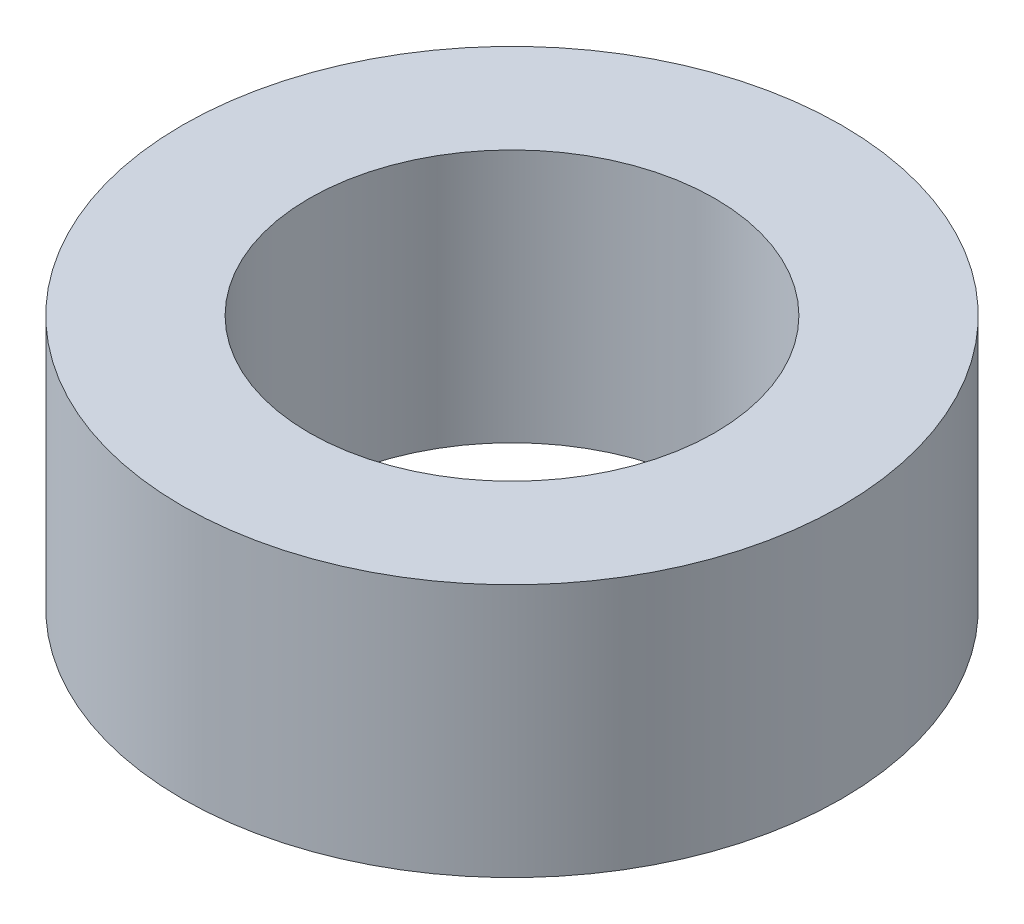
ISO-10303-21;
HEADER;
FILE_DESCRIPTION(('STEP AP214'),'2;1');
FILE_NAME('part.step','',(''),(''),'','','');
FILE_SCHEMA(('AUTOMOTIVE_DESIGN { 1 0 10303 214 1 1 1 1 }'));
ENDSEC;
DATA;
#1=APPLICATION_CONTEXT('core data for automotive mechanical design processes');
#2=APPLICATION_PROTOCOL_DEFINITION('international standard','automotive_design',2000,#1);
#3=PRODUCT_CONTEXT('',#1,'mechanical');
#4=PRODUCT('Part','Part','',(#3));
#5=PRODUCT_RELATED_PRODUCT_CATEGORY('part','',(#4));
#6=PRODUCT_DEFINITION_FORMATION('','',#4);
#7=PRODUCT_DEFINITION_CONTEXT('part definition',#1,'design');
#8=PRODUCT_DEFINITION('design','',#6,#7);
#9=PRODUCT_DEFINITION_SHAPE('','',#8);
#10=(LENGTH_UNIT() NAMED_UNIT(*) SI_UNIT(.MILLI.,.METRE.));
#11=(NAMED_UNIT(*) PLANE_ANGLE_UNIT() SI_UNIT($,.RADIAN.));
#12=(NAMED_UNIT(*) SI_UNIT($,.STERADIAN.) SOLID_ANGLE_UNIT());
#13=UNCERTAINTY_MEASURE_WITH_UNIT(LENGTH_MEASURE(1.E-05),#10,'distance_accuracy_value','');
#14=(GEOMETRIC_REPRESENTATION_CONTEXT(3) GLOBAL_UNCERTAINTY_ASSIGNED_CONTEXT((#13)) GLOBAL_UNIT_ASSIGNED_CONTEXT((#10,
#11,#12)) REPRESENTATION_CONTEXT('',''));
#15=CARTESIAN_POINT('',(0.,0.,0.));
#16=DIRECTION('',(0.,0.,1.));
#17=DIRECTION('',(1.,0.,0.));
#18=AXIS2_PLACEMENT_3D('',#15,#16,#17);
#19=CARTESIAN_POINT('',(0.,5.,0.));
#20=DIRECTION('',(0.,1.,0.));
#21=DIRECTION('',(0.,0.,1.));
#22=AXIS2_PLACEMENT_3D('',#19,#20,#21);
#23=PLANE('',#22);
#24=CARTESIAN_POINT('',(0.,5.,0.));
#25=DIRECTION('',(0.,1.,0.));
#26=DIRECTION('',(0.,0.,1.));
#27=AXIS2_PLACEMENT_3D('',#24,#25,#26);
#28=CIRCLE('',#27,6.5);
#29=CARTESIAN_POINT('',(0.,5.,6.5));
#30=VERTEX_POINT('',#29);
#31=EDGE_CURVE('E10',#30,#30,#28,.T.);
#32=ORIENTED_EDGE('',*,*,#31,.T.);
#33=EDGE_LOOP('',(#32));
#34=FACE_BOUND('',#33,.T.);
#35=CARTESIAN_POINT('',(0.,5.,0.));
#36=DIRECTION('',(0.,1.,0.));
#37=DIRECTION('',(0.,0.,1.));
#38=AXIS2_PLACEMENT_3D('',#35,#36,#37);
#39=CIRCLE('',#38,4.);
#40=CARTESIAN_POINT('',(0.,5.,4.));
#41=VERTEX_POINT('',#40);
#42=EDGE_CURVE('E45',#41,#41,#39,.T.);
#43=ORIENTED_EDGE('',*,*,#42,.F.);
#44=EDGE_LOOP('',(#43));
#45=FACE_BOUND('',#44,.T.);
#46=ADVANCED_FACE('F34',(#34,#45),#23,.T.);
#47=CARTESIAN_POINT('',(0.,0.,0.));
#48=DIRECTION('',(0.,1.,0.));
#49=DIRECTION('',(0.,0.,1.));
#50=AXIS2_PLACEMENT_3D('',#47,#48,#49);
#51=PLANE('',#50);
#52=CARTESIAN_POINT('',(0.,0.,0.));
#53=DIRECTION('',(0.,1.,0.));
#54=DIRECTION('',(0.,0.,1.));
#55=AXIS2_PLACEMENT_3D('',#52,#53,#54);
#56=CIRCLE('',#55,6.5);
#57=CARTESIAN_POINT('',(0.,0.,6.5));
#58=VERTEX_POINT('',#57);
#59=EDGE_CURVE('E38',#58,#58,#56,.T.);
#60=ORIENTED_EDGE('',*,*,#59,.F.);
#61=EDGE_LOOP('',(#60));
#62=FACE_BOUND('',#61,.T.);
#63=CARTESIAN_POINT('',(0.,0.,0.));
#64=DIRECTION('',(0.,1.,0.));
#65=DIRECTION('',(0.,0.,1.));
#66=AXIS2_PLACEMENT_3D('',#63,#64,#65);
#67=CIRCLE('',#66,4.);
#68=CARTESIAN_POINT('',(0.,0.,4.));
#69=VERTEX_POINT('',#68);
#70=EDGE_CURVE('E47',#69,#69,#67,.T.);
#71=ORIENTED_EDGE('',*,*,#70,.T.);
#72=EDGE_LOOP('',(#71));
#73=FACE_BOUND('',#72,.T.);
#74=ADVANCED_FACE('F57',(#62,#73),#51,.F.);
#75=CARTESIAN_POINT('',(0.,5.,0.));
#76=DIRECTION('',(0.,-1.,0.));
#77=DIRECTION('',(0.,0.,-1.));
#78=AXIS2_PLACEMENT_3D('',#75,#76,#77);
#79=CYLINDRICAL_SURFACE('',#78,6.5);
#80=ORIENTED_EDGE('',*,*,#31,.F.);
#81=EDGE_LOOP('',(#80));
#82=FACE_BOUND('',#81,.T.);
#83=ORIENTED_EDGE('',*,*,#59,.T.);
#84=EDGE_LOOP('',(#83));
#85=FACE_BOUND('',#84,.T.);
#86=ADVANCED_FACE('F36',(#82,#85),#79,.T.);
#87=CARTESIAN_POINT('',(0.,5.,0.));
#88=DIRECTION('',(0.,-1.,0.));
#89=DIRECTION('',(0.,0.,-1.));
#90=AXIS2_PLACEMENT_3D('',#87,#88,#89);
#91=CYLINDRICAL_SURFACE('',#90,4.);
#92=ORIENTED_EDGE('',*,*,#42,.T.);
#93=EDGE_LOOP('',(#92));
#94=FACE_BOUND('',#93,.T.);
#95=ORIENTED_EDGE('',*,*,#70,.F.);
#96=EDGE_LOOP('',(#95));
#97=FACE_BOUND('',#96,.T.);
#98=ADVANCED_FACE('F53',(#94,#97),#91,.F.);
#99=CLOSED_SHELL('',(#46,#74,#86,#98));
#100=MANIFOLD_SOLID_BREP('B2',#99);
#101=ADVANCED_BREP_SHAPE_REPRESENTATION('',(#18,#100),#14);
#102=SHAPE_DEFINITION_REPRESENTATION(#9,#101);
ENDSEC;
END-ISO-10303-21;
